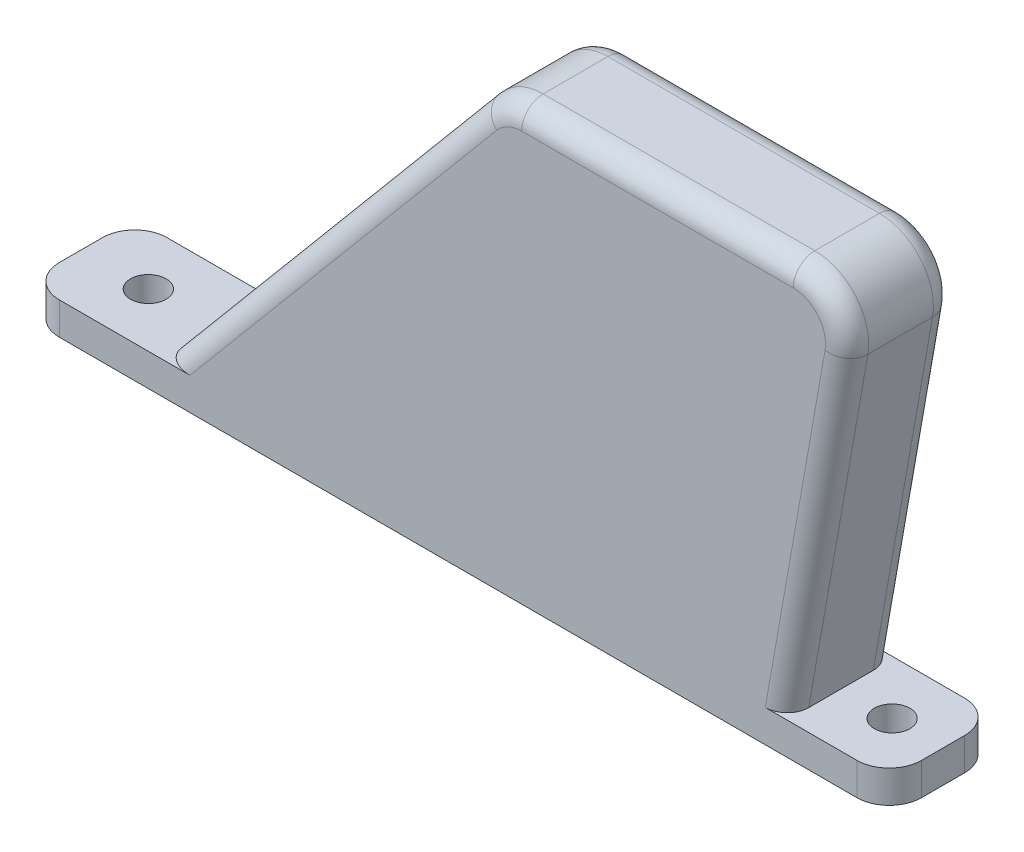
ISO-10303-21;
HEADER;
FILE_DESCRIPTION(('STEP AP214'),'2;1');
FILE_NAME('part.step','',(''),(''),'','','');
FILE_SCHEMA(('AUTOMOTIVE_DESIGN { 1 0 10303 214 1 1 1 1 }'));
ENDSEC;
DATA;
#1=APPLICATION_CONTEXT('core data for automotive mechanical design processes');
#2=APPLICATION_PROTOCOL_DEFINITION('international standard','automotive_design',2000,#1);
#3=PRODUCT_CONTEXT('',#1,'mechanical');
#4=PRODUCT('Part','Part','',(#3));
#5=PRODUCT_RELATED_PRODUCT_CATEGORY('part','',(#4));
#6=PRODUCT_DEFINITION_FORMATION('','',#4);
#7=PRODUCT_DEFINITION_CONTEXT('part definition',#1,'design');
#8=PRODUCT_DEFINITION('design','',#6,#7);
#9=PRODUCT_DEFINITION_SHAPE('','',#8);
#10=(LENGTH_UNIT() NAMED_UNIT(*) SI_UNIT(.MILLI.,.METRE.));
#11=(NAMED_UNIT(*) PLANE_ANGLE_UNIT() SI_UNIT($,.RADIAN.));
#12=(NAMED_UNIT(*) SI_UNIT($,.STERADIAN.) SOLID_ANGLE_UNIT());
#13=UNCERTAINTY_MEASURE_WITH_UNIT(LENGTH_MEASURE(1.E-05),#10,'distance_accuracy_value','');
#14=(GEOMETRIC_REPRESENTATION_CONTEXT(3) GLOBAL_UNCERTAINTY_ASSIGNED_CONTEXT((#13)) GLOBAL_UNIT_ASSIGNED_CONTEXT((#10,
#11,#12)) REPRESENTATION_CONTEXT('',''));
#15=CARTESIAN_POINT('',(0.,0.,0.));
#16=DIRECTION('',(0.,0.,1.));
#17=DIRECTION('',(1.,0.,0.));
#18=AXIS2_PLACEMENT_3D('',#15,#16,#17);
#19=CARTESIAN_POINT('',(0.,0.,10.));
#20=DIRECTION('',(-0.766044443118979,0.642787609686538,0.));
#21=DIRECTION('',(-0.642787609686538,-0.766044443118979,0.));
#22=AXIS2_PLACEMENT_3D('',#19,#20,#21);
#23=PLANE('',#22);
#24=DIRECTION('',(0.,0.,-1.));
#25=VECTOR('',#24,1.);
#26=CARTESIAN_POINT('',(32.0653013222712,38.2139380484327,10.));
#27=LINE('',#26,#25);
#28=CARTESIAN_POINT('',(32.0653013222712,38.2139380484327,8.));
#29=VERTEX_POINT('',#28);
#30=CARTESIAN_POINT('',(32.0653013222712,38.2139380484327,2.));
#31=VERTEX_POINT('',#30);
#32=EDGE_CURVE('E250',#29,#31,#27,.T.);
#33=ORIENTED_EDGE('',*,*,#32,.T.);
#34=DIRECTION('',(0.642787609686538,0.766044443118979,0.));
#35=VECTOR('',#34,1.);
#36=CARTESIAN_POINT('',(2.51729889353183,3.,2.));
#37=LINE('',#36,#35);
#38=CARTESIAN_POINT('',(2.51729889353183,3.,2.));
#39=VERTEX_POINT('',#38);
#40=EDGE_CURVE('E67',#31,#39,#37,.F.);
#41=ORIENTED_EDGE('',*,*,#40,.T.);
#42=DIRECTION('',(0.,0.,1.));
#43=VECTOR('',#42,1.);
#44=CARTESIAN_POINT('',(2.51729889353183,3.,10.));
#45=LINE('',#44,#43);
#46=CARTESIAN_POINT('',(2.51729889353183,3.,8.));
#47=VERTEX_POINT('',#46);
#48=EDGE_CURVE('E365',#39,#47,#45,.T.);
#49=ORIENTED_EDGE('',*,*,#48,.T.);
#50=DIRECTION('',(0.642787609686538,0.766044443118979,0.));
#51=VECTOR('',#50,1.);
#52=CARTESIAN_POINT('',(0.,0.,8.));
#53=LINE('',#52,#51);
#54=EDGE_CURVE('E292',#47,#29,#53,.T.);
#55=ORIENTED_EDGE('',*,*,#54,.T.);
#56=EDGE_LOOP('',(#33,#41,#49,#55));
#57=FACE_BOUND('',#56,.T.);
#58=ADVANCED_FACE('F45',(#57),#23,.T.);
#59=CARTESIAN_POINT('',(58.1907786235773,-10.2606042997699,10.));
#60=DIRECTION('',(-0.984807753012209,0.173648177666927,0.));
#61=DIRECTION('',(-0.173648177666927,-0.984807753012209,0.));
#62=AXIS2_PLACEMENT_3D('',#59,#60,#61);
#63=PLANE('',#62);
#64=DIRECTION('',(0.,0.,1.));
#65=VECTOR('',#64,1.);
#66=CARTESIAN_POINT('',(60.5289809421254,3.,10.));
#67=LINE('',#66,#65);
#68=CARTESIAN_POINT('',(60.5289809421254,3.,2.));
#69=VERTEX_POINT('',#68);
#70=CARTESIAN_POINT('',(60.5289809421254,3.,8.));
#71=VERTEX_POINT('',#70);
#72=EDGE_CURVE('E363',#69,#71,#67,.T.);
#73=ORIENTED_EDGE('',*,*,#72,.F.);
#74=DIRECTION('',(0.173648177666927,0.984807753012209,0.));
#75=VECTOR('',#74,1.);
#76=CARTESIAN_POINT('',(58.1907786235773,-10.2606042997699,2.));
#77=LINE('',#76,#75);
#78=CARTESIAN_POINT('',(66.0183500304285,34.1317591116654,2.));
#79=VERTEX_POINT('',#78);
#80=EDGE_CURVE('E254',#69,#79,#77,.T.);
#81=ORIENTED_EDGE('',*,*,#80,.T.);
#82=DIRECTION('',(0.,0.,-1.));
#83=VECTOR('',#82,1.);
#84=CARTESIAN_POINT('',(66.0183500304285,34.1317591116654,10.));
#85=LINE('',#84,#83);
#86=CARTESIAN_POINT('',(66.0183500304285,34.1317591116654,8.));
#87=VERTEX_POINT('',#86);
#88=EDGE_CURVE('E247',#79,#87,#85,.F.);
#89=ORIENTED_EDGE('',*,*,#88,.T.);
#90=DIRECTION('',(0.173648177666927,0.984807753012209,0.));
#91=VECTOR('',#90,1.);
#92=CARTESIAN_POINT('',(60.5289809421254,3.,8.));
#93=LINE('',#92,#91);
#94=EDGE_CURVE('E252',#87,#71,#93,.F.);
#95=ORIENTED_EDGE('',*,*,#94,.T.);
#96=EDGE_LOOP('',(#73,#81,#89,#95));
#97=FACE_BOUND('',#96,.T.);
#98=ADVANCED_FACE('F351',(#97),#63,.F.);
#99=CARTESIAN_POINT('',(0.,40.,10.));
#100=DIRECTION('',(0.,1.,0.));
#101=DIRECTION('',(-1.,0.,0.));
#102=AXIS2_PLACEMENT_3D('',#99,#100,#101);
#103=PLANE('',#102);
#104=DIRECTION('',(0.,0.,-1.));
#105=VECTOR('',#104,1.);
#106=CARTESIAN_POINT('',(61.0943112653674,40.,0.));
#107=LINE('',#106,#105);
#108=CARTESIAN_POINT('',(61.0943112653674,40.,8.));
#109=VERTEX_POINT('',#108);
#110=CARTESIAN_POINT('',(61.0943112653674,40.,2.));
#111=VERTEX_POINT('',#110);
#112=EDGE_CURVE('E244',#109,#111,#107,.T.);
#113=ORIENTED_EDGE('',*,*,#112,.T.);
#114=DIRECTION('',(1.,0.,0.));
#115=VECTOR('',#114,1.);
#116=CARTESIAN_POINT('',(35.8955235378661,40.,2.));
#117=LINE('',#116,#115);
#118=CARTESIAN_POINT('',(35.8955235378661,40.,2.));
#119=VERTEX_POINT('',#118);
#120=EDGE_CURVE('E274',#111,#119,#117,.F.);
#121=ORIENTED_EDGE('',*,*,#120,.T.);
#122=DIRECTION('',(0.,0.,-1.));
#123=VECTOR('',#122,1.);
#124=CARTESIAN_POINT('',(35.8955235378661,40.,10.));
#125=LINE('',#124,#123);
#126=CARTESIAN_POINT('',(35.8955235378661,40.,8.));
#127=VERTEX_POINT('',#126);
#128=EDGE_CURVE('E241',#119,#127,#125,.F.);
#129=ORIENTED_EDGE('',*,*,#128,.T.);
#130=DIRECTION('',(1.,0.,0.));
#131=VECTOR('',#130,1.);
#132=CARTESIAN_POINT('',(0.,40.,8.));
#133=LINE('',#132,#131);
#134=EDGE_CURVE('E272',#127,#109,#133,.T.);
#135=ORIENTED_EDGE('',*,*,#134,.T.);
#136=EDGE_LOOP('',(#113,#121,#129,#135));
#137=FACE_BOUND('',#136,.T.);
#138=ADVANCED_FACE('F422',(#137),#103,.T.);
#139=CARTESIAN_POINT('',(0.,0.,10.));
#140=DIRECTION('',(0.,1.,0.));
#141=DIRECTION('',(0.,0.,1.));
#142=AXIS2_PLACEMENT_3D('',#139,#140,#141);
#143=PLANE('',#142);
#144=CARTESIAN_POINT('',(65.2644904710627,0.,5.));
#145=DIRECTION('',(0.,1.,0.));
#146=DIRECTION('',(0.,0.,1.));
#147=AXIS2_PLACEMENT_3D('',#144,#145,#146);
#148=CIRCLE('',#147,1.65);
#149=CARTESIAN_POINT('',(65.2644904710627,0.,6.65));
#150=VERTEX_POINT('',#149);
#151=EDGE_CURVE('E204',#150,#150,#148,.T.);
#152=ORIENTED_EDGE('',*,*,#151,.T.);
#153=EDGE_LOOP('',(#152));
#154=FACE_BOUND('',#153,.T.);
#155=CARTESIAN_POINT('',(-3.74135055323408,0.,5.));
#156=DIRECTION('',(0.,1.,0.));
#157=DIRECTION('',(0.,0.,1.));
#158=AXIS2_PLACEMENT_3D('',#155,#156,#157);
#159=CIRCLE('',#158,1.65);
#160=CARTESIAN_POINT('',(-3.74135055323408,0.,6.65));
#161=VERTEX_POINT('',#160);
#162=EDGE_CURVE('E313',#161,#161,#159,.T.);
#163=ORIENTED_EDGE('',*,*,#162,.T.);
#164=EDGE_LOOP('',(#163));
#165=FACE_BOUND('',#164,.T.);
#166=DIRECTION('',(0.,0.,-1.));
#167=VECTOR('',#166,1.);
#168=CARTESIAN_POINT('',(-10.,0.,10.));
#169=LINE('',#168,#167);
#170=CARTESIAN_POINT('',(-10.,0.,7.));
#171=VERTEX_POINT('',#170);
#172=CARTESIAN_POINT('',(-10.,0.,3.));
#173=VERTEX_POINT('',#172);
#174=EDGE_CURVE('E186',#171,#173,#169,.T.);
#175=ORIENTED_EDGE('',*,*,#174,.T.);
#176=CARTESIAN_POINT('',(-7.,0.,3.));
#177=DIRECTION('',(0.,1.,0.));
#178=DIRECTION('',(0.,0.,1.));
#179=AXIS2_PLACEMENT_3D('',#176,#177,#178);
#180=CIRCLE('',#179,3.);
#181=CARTESIAN_POINT('',(-7.,0.,0.));
#182=VERTEX_POINT('',#181);
#183=EDGE_CURVE('E218',#173,#182,#180,.F.);
#184=ORIENTED_EDGE('',*,*,#183,.T.);
#185=DIRECTION('',(1.,0.,0.));
#186=VECTOR('',#185,1.);
#187=CARTESIAN_POINT('',(0.,0.,0.));
#188=LINE('',#187,#186);
#189=CARTESIAN_POINT('',(67.,0.,0.));
#190=VERTEX_POINT('',#189);
#191=EDGE_CURVE('E211',#182,#190,#188,.T.);
#192=ORIENTED_EDGE('',*,*,#191,.T.);
#193=CARTESIAN_POINT('',(67.,0.,3.));
#194=DIRECTION('',(0.,1.,0.));
#195=DIRECTION('',(0.,0.,1.));
#196=AXIS2_PLACEMENT_3D('',#193,#194,#195);
#197=CIRCLE('',#196,3.);
#198=CARTESIAN_POINT('',(70.,0.,3.));
#199=VERTEX_POINT('',#198);
#200=EDGE_CURVE('E193',#190,#199,#197,.F.);
#201=ORIENTED_EDGE('',*,*,#200,.T.);
#202=DIRECTION('',(0.,0.,1.));
#203=VECTOR('',#202,1.);
#204=CARTESIAN_POINT('',(70.,0.,0.));
#205=LINE('',#204,#203);
#206=CARTESIAN_POINT('',(70.,0.,7.));
#207=VERTEX_POINT('',#206);
#208=EDGE_CURVE('E203',#199,#207,#205,.T.);
#209=ORIENTED_EDGE('',*,*,#208,.T.);
#210=CARTESIAN_POINT('',(67.,0.,7.));
#211=DIRECTION('',(0.,1.,0.));
#212=DIRECTION('',(0.,0.,1.));
#213=AXIS2_PLACEMENT_3D('',#210,#211,#212);
#214=CIRCLE('',#213,3.);
#215=CARTESIAN_POINT('',(67.,0.,10.));
#216=VERTEX_POINT('',#215);
#217=EDGE_CURVE('E216',#207,#216,#214,.F.);
#218=ORIENTED_EDGE('',*,*,#217,.T.);
#219=DIRECTION('',(1.,0.,0.));
#220=VECTOR('',#219,1.);
#221=CARTESIAN_POINT('',(0.,0.,10.));
#222=LINE('',#221,#220);
#223=CARTESIAN_POINT('',(-7.,0.,10.));
#224=VERTEX_POINT('',#223);
#225=EDGE_CURVE('E188',#224,#216,#222,.T.);
#226=ORIENTED_EDGE('',*,*,#225,.F.);
#227=CARTESIAN_POINT('',(-7.,0.,7.));
#228=DIRECTION('',(0.,1.,0.));
#229=DIRECTION('',(0.,0.,1.));
#230=AXIS2_PLACEMENT_3D('',#227,#228,#229);
#231=CIRCLE('',#230,3.);
#232=EDGE_CURVE('E183',#224,#171,#231,.F.);
#233=ORIENTED_EDGE('',*,*,#232,.T.);
#234=EDGE_LOOP('',(#175,#184,#192,#201,#209,#218,#226,#233));
#235=FACE_BOUND('',#234,.T.);
#236=ADVANCED_FACE('F185',(#154,#165,#235),#143,.F.);
#237=CARTESIAN_POINT('',(0.,0.,10.));
#238=DIRECTION('',(0.,0.,1.));
#239=DIRECTION('',(1.,0.,0.));
#240=AXIS2_PLACEMENT_3D('',#237,#238,#239);
#241=PLANE('',#240);
#242=DIRECTION('',(-1.,0.,0.));
#243=VECTOR('',#242,1.);
#244=CARTESIAN_POINT('',(60.,3.,10.));
#245=LINE('',#244,#243);
#246=CARTESIAN_POINT('',(67.,3.,10.));
#247=VERTEX_POINT('',#246);
#248=CARTESIAN_POINT('',(58.4981277183539,3.,10.));
#249=VERTEX_POINT('',#248);
#250=EDGE_CURVE('E361',#247,#249,#245,.T.);
#251=ORIENTED_EDGE('',*,*,#250,.T.);
#252=DIRECTION('',(0.173648177666927,0.984807753012209,0.));
#253=VECTOR('',#252,1.);
#254=CARTESIAN_POINT('',(64.0487345244041,34.4790554669992,10.));
#255=LINE('',#254,#253);
#256=CARTESIAN_POINT('',(64.0487345244041,34.4790554669992,10.));
#257=VERTEX_POINT('',#256);
#258=EDGE_CURVE('E289',#249,#257,#255,.T.);
#259=ORIENTED_EDGE('',*,*,#258,.T.);
#260=CARTESIAN_POINT('',(61.0943112653674,35.,10.));
#261=DIRECTION('',(0.,0.,1.));
#262=DIRECTION('',(1.,0.,0.));
#263=AXIS2_PLACEMENT_3D('',#260,#261,#262);
#264=CIRCLE('',#263,3.);
#265=CARTESIAN_POINT('',(61.0943112653674,38.,10.));
#266=VERTEX_POINT('',#265);
#267=EDGE_CURVE('E287',#257,#266,#264,.T.);
#268=ORIENTED_EDGE('',*,*,#267,.T.);
#269=DIRECTION('',(1.,0.,0.));
#270=VECTOR('',#269,1.);
#271=CARTESIAN_POINT('',(0.,38.,10.));
#272=LINE('',#271,#270);
#273=CARTESIAN_POINT('',(35.8955235378661,38.,10.));
#274=VERTEX_POINT('',#273);
#275=EDGE_CURVE('E285',#266,#274,#272,.F.);
#276=ORIENTED_EDGE('',*,*,#275,.T.);
#277=CARTESIAN_POINT('',(35.8955235378661,35.,10.));
#278=DIRECTION('',(0.,0.,1.));
#279=DIRECTION('',(1.,0.,0.));
#280=AXIS2_PLACEMENT_3D('',#277,#278,#279);
#281=CIRCLE('',#280,3.);
#282=CARTESIAN_POINT('',(33.5973902085091,36.9283628290596,10.));
#283=VERTEX_POINT('',#282);
#284=EDGE_CURVE('E283',#274,#283,#281,.T.);
#285=ORIENTED_EDGE('',*,*,#284,.T.);
#286=DIRECTION('',(0.642787609686538,0.766044443118979,0.));
#287=VECTOR('',#286,1.);
#288=CARTESIAN_POINT('',(1.53208888623796,-1.28557521937308,10.));
#289=LINE('',#288,#287);
#290=CARTESIAN_POINT('',(5.12811347219638,3.,10.));
#291=VERTEX_POINT('',#290);
#292=EDGE_CURVE('E280',#283,#291,#289,.F.);
#293=ORIENTED_EDGE('',*,*,#292,.T.);
#294=CARTESIAN_POINT('',(-6.99999999999999,3.,10.));
#295=VERTEX_POINT('',#294);
#296=EDGE_CURVE('E336',#291,#295,#245,.T.);
#297=ORIENTED_EDGE('',*,*,#296,.T.);
#298=DIRECTION('',(0.,-1.,0.));
#299=VECTOR('',#298,1.);
#300=CARTESIAN_POINT('',(-7.,0.,10.));
#301=LINE('',#300,#299);
#302=EDGE_CURVE('E233',#295,#224,#301,.T.);
#303=ORIENTED_EDGE('',*,*,#302,.T.);
#304=ORIENTED_EDGE('',*,*,#225,.T.);
#305=DIRECTION('',(0.,-1.,0.));
#306=VECTOR('',#305,1.);
#307=CARTESIAN_POINT('',(67.,0.,10.));
#308=LINE('',#307,#306);
#309=EDGE_CURVE('E235',#216,#247,#308,.F.);
#310=ORIENTED_EDGE('',*,*,#309,.T.);
#311=EDGE_LOOP('',(#251,#259,#268,#276,#285,#293,#297,#303,#304,#310));
#312=FACE_BOUND('',#311,.T.);
#313=ADVANCED_FACE('F335',(#312),#241,.T.);
#314=CARTESIAN_POINT('',(0.,0.,0.));
#315=DIRECTION('',(0.,0.,1.));
#316=DIRECTION('',(1.,0.,0.));
#317=AXIS2_PLACEMENT_3D('',#314,#315,#316);
#318=PLANE('',#317);
#319=DIRECTION('',(0.173648177666927,0.984807753012209,0.));
#320=VECTOR('',#319,1.);
#321=CARTESIAN_POINT('',(56.2211631175529,-9.91330794443604,0.));
#322=LINE('',#321,#320);
#323=CARTESIAN_POINT('',(64.0487345244041,34.4790554669992,0.));
#324=VERTEX_POINT('',#323);
#325=CARTESIAN_POINT('',(58.4981277183539,3.,0.));
#326=VERTEX_POINT('',#325);
#327=EDGE_CURVE('E265',#324,#326,#322,.F.);
#328=ORIENTED_EDGE('',*,*,#327,.T.);
#329=DIRECTION('',(1.,0.,0.));
#330=VECTOR('',#329,1.);
#331=CARTESIAN_POINT('',(-10.,3.,0.));
#332=LINE('',#331,#330);
#333=CARTESIAN_POINT('',(67.,3.,0.));
#334=VERTEX_POINT('',#333);
#335=EDGE_CURVE('E376',#326,#334,#332,.T.);
#336=ORIENTED_EDGE('',*,*,#335,.T.);
#337=DIRECTION('',(0.,-1.,0.));
#338=VECTOR('',#337,1.);
#339=CARTESIAN_POINT('',(67.,0.,0.));
#340=LINE('',#339,#338);
#341=EDGE_CURVE('E220',#334,#190,#340,.T.);
#342=ORIENTED_EDGE('',*,*,#341,.T.);
#343=ORIENTED_EDGE('',*,*,#191,.F.);
#344=DIRECTION('',(0.,-1.,0.));
#345=VECTOR('',#344,1.);
#346=CARTESIAN_POINT('',(-7.,3.,0.));
#347=LINE('',#346,#345);
#348=CARTESIAN_POINT('',(-7.,3.,0.));
#349=VERTEX_POINT('',#348);
#350=EDGE_CURVE('E223',#182,#349,#347,.F.);
#351=ORIENTED_EDGE('',*,*,#350,.T.);
#352=CARTESIAN_POINT('',(5.12811347219638,3.,0.));
#353=VERTEX_POINT('',#352);
#354=EDGE_CURVE('E370',#349,#353,#332,.T.);
#355=ORIENTED_EDGE('',*,*,#354,.T.);
#356=DIRECTION('',(0.642787609686538,0.766044443118979,0.));
#357=VECTOR('',#356,1.);
#358=CARTESIAN_POINT('',(33.5973902085091,36.9283628290596,0.));
#359=LINE('',#358,#357);
#360=CARTESIAN_POINT('',(33.5973902085091,36.9283628290596,0.));
#361=VERTEX_POINT('',#360);
#362=EDGE_CURVE('E257',#353,#361,#359,.T.);
#363=ORIENTED_EDGE('',*,*,#362,.T.);
#364=CARTESIAN_POINT('',(35.8955235378661,35.,0.));
#365=DIRECTION('',(0.,0.,1.));
#366=DIRECTION('',(1.,0.,0.));
#367=AXIS2_PLACEMENT_3D('',#364,#365,#366);
#368=CIRCLE('',#367,3.);
#369=CARTESIAN_POINT('',(35.8955235378661,38.,0.));
#370=VERTEX_POINT('',#369);
#371=EDGE_CURVE('E259',#361,#370,#368,.F.);
#372=ORIENTED_EDGE('',*,*,#371,.T.);
#373=DIRECTION('',(1.,0.,0.));
#374=VECTOR('',#373,1.);
#375=CARTESIAN_POINT('',(61.0943112653674,38.,0.));
#376=LINE('',#375,#374);
#377=CARTESIAN_POINT('',(61.0943112653674,38.,0.));
#378=VERTEX_POINT('',#377);
#379=EDGE_CURVE('E261',#370,#378,#376,.T.);
#380=ORIENTED_EDGE('',*,*,#379,.T.);
#381=CARTESIAN_POINT('',(61.0943112653674,35.,0.));
#382=DIRECTION('',(0.,0.,1.));
#383=DIRECTION('',(1.,0.,0.));
#384=AXIS2_PLACEMENT_3D('',#381,#382,#383);
#385=CIRCLE('',#384,3.);
#386=EDGE_CURVE('E263',#378,#324,#385,.F.);
#387=ORIENTED_EDGE('',*,*,#386,.T.);
#388=EDGE_LOOP('',(#328,#336,#342,#343,#351,#355,#363,#372,#380,#387));
#389=FACE_BOUND('',#388,.T.);
#390=ADVANCED_FACE('F411',(#389),#318,.F.);
#391=CARTESIAN_POINT('',(70.,3.,0.));
#392=DIRECTION('',(1.,0.,0.));
#393=DIRECTION('',(0.,0.,-1.));
#394=AXIS2_PLACEMENT_3D('',#391,#392,#393);
#395=PLANE('',#394);
#396=DIRECTION('',(0.,0.,1.));
#397=VECTOR('',#396,1.);
#398=CARTESIAN_POINT('',(70.,3.,0.));
#399=LINE('',#398,#397);
#400=CARTESIAN_POINT('',(70.,3.,3.));
#401=VERTEX_POINT('',#400);
#402=CARTESIAN_POINT('',(70.,3.,7.));
#403=VERTEX_POINT('',#402);
#404=EDGE_CURVE('E366',#401,#403,#399,.T.);
#405=ORIENTED_EDGE('',*,*,#404,.T.);
#406=DIRECTION('',(0.,-1.,0.));
#407=VECTOR('',#406,1.);
#408=CARTESIAN_POINT('',(70.,3.,7.));
#409=LINE('',#408,#407);
#410=EDGE_CURVE('E230',#403,#207,#409,.T.);
#411=ORIENTED_EDGE('',*,*,#410,.T.);
#412=ORIENTED_EDGE('',*,*,#208,.F.);
#413=DIRECTION('',(0.,-1.,0.));
#414=VECTOR('',#413,1.);
#415=CARTESIAN_POINT('',(70.,3.,3.));
#416=LINE('',#415,#414);
#417=EDGE_CURVE('E228',#199,#401,#416,.F.);
#418=ORIENTED_EDGE('',*,*,#417,.T.);
#419=EDGE_LOOP('',(#405,#411,#412,#418));
#420=FACE_BOUND('',#419,.T.);
#421=ADVANCED_FACE('F401',(#420),#395,.T.);
#422=CARTESIAN_POINT('',(0.,3.,0.));
#423=DIRECTION('',(0.,-1.,0.));
#424=DIRECTION('',(0.,0.,-1.));
#425=AXIS2_PLACEMENT_3D('',#422,#423,#424);
#426=PLANE('',#425);
#427=CARTESIAN_POINT('',(65.2644904710627,3.,5.));
#428=DIRECTION('',(0.,1.,0.));
#429=DIRECTION('',(0.,0.,1.));
#430=AXIS2_PLACEMENT_3D('',#427,#428,#429);
#431=CIRCLE('',#430,1.65);
#432=CARTESIAN_POINT('',(65.2644904710627,3.,6.65));
#433=VERTEX_POINT('',#432);
#434=EDGE_CURVE('E385',#433,#433,#431,.T.);
#435=ORIENTED_EDGE('',*,*,#434,.F.);
#436=EDGE_LOOP('',(#435));
#437=FACE_BOUND('',#436,.T.);
#438=ORIENTED_EDGE('',*,*,#250,.F.);
#439=CARTESIAN_POINT('',(67.,3.,7.));
#440=DIRECTION('',(0.,-1.,0.));
#441=DIRECTION('',(0.,0.,-1.));
#442=AXIS2_PLACEMENT_3D('',#439,#440,#441);
#443=CIRCLE('',#442,3.);
#444=EDGE_CURVE('E239',#247,#403,#443,.F.);
#445=ORIENTED_EDGE('',*,*,#444,.T.);
#446=ORIENTED_EDGE('',*,*,#404,.F.);
#447=CARTESIAN_POINT('',(67.,3.,3.));
#448=DIRECTION('',(0.,-1.,0.));
#449=DIRECTION('',(0.,0.,-1.));
#450=AXIS2_PLACEMENT_3D('',#447,#448,#449);
#451=CIRCLE('',#450,3.);
#452=EDGE_CURVE('E237',#401,#334,#451,.F.);
#453=ORIENTED_EDGE('',*,*,#452,.T.);
#454=ORIENTED_EDGE('',*,*,#335,.F.);
#455=CARTESIAN_POINT('',(58.4981277183539,3.,2.));
#456=DIRECTION('',(0.,-1.,0.));
#457=DIRECTION('',(1.,0.,0.));
#458=AXIS2_PLACEMENT_3D('',#455,#456,#457);
#459=ELLIPSE('',#458,2.03085322377149,2.);
#460=EDGE_CURVE('E295',#326,#69,#459,.T.);
#461=ORIENTED_EDGE('',*,*,#460,.T.);
#462=ORIENTED_EDGE('',*,*,#72,.T.);
#463=CARTESIAN_POINT('',(58.4981277183539,3.,8.));
#464=DIRECTION('',(0.,-1.,0.));
#465=DIRECTION('',(-1.,0.,0.));
#466=AXIS2_PLACEMENT_3D('',#463,#464,#465);
#467=ELLIPSE('',#466,2.03085322377149,2.);
#468=EDGE_CURVE('E297',#71,#249,#467,.T.);
#469=ORIENTED_EDGE('',*,*,#468,.T.);
#470=EDGE_LOOP('',(#438,#445,#446,#453,#454,#461,#462,#469));
#471=FACE_BOUND('',#470,.T.);
#472=ADVANCED_FACE('F360',(#437,#471),#426,.F.);
#473=CARTESIAN_POINT('',(-10.,3.,10.));
#474=DIRECTION('',(-1.,0.,0.));
#475=DIRECTION('',(0.,0.,1.));
#476=AXIS2_PLACEMENT_3D('',#473,#474,#475);
#477=PLANE('',#476);
#478=DIRECTION('',(0.,0.,-1.));
#479=VECTOR('',#478,1.);
#480=CARTESIAN_POINT('',(-10.,3.,10.));
#481=LINE('',#480,#479);
#482=CARTESIAN_POINT('',(-10.,3.,7.));
#483=VERTEX_POINT('',#482);
#484=CARTESIAN_POINT('',(-10.,3.,3.));
#485=VERTEX_POINT('',#484);
#486=EDGE_CURVE('E377',#483,#485,#481,.T.);
#487=ORIENTED_EDGE('',*,*,#486,.T.);
#488=DIRECTION('',(0.,-1.,0.));
#489=VECTOR('',#488,1.);
#490=CARTESIAN_POINT('',(-10.,0.,3.));
#491=LINE('',#490,#489);
#492=EDGE_CURVE('E194',#485,#173,#491,.T.);
#493=ORIENTED_EDGE('',*,*,#492,.T.);
#494=ORIENTED_EDGE('',*,*,#174,.F.);
#495=DIRECTION('',(0.,-1.,0.));
#496=VECTOR('',#495,1.);
#497=CARTESIAN_POINT('',(-10.,3.,7.));
#498=LINE('',#497,#496);
#499=EDGE_CURVE('E200',#171,#483,#498,.F.);
#500=ORIENTED_EDGE('',*,*,#499,.T.);
#501=EDGE_LOOP('',(#487,#493,#494,#500));
#502=FACE_BOUND('',#501,.T.);
#503=ADVANCED_FACE('F199',(#502),#477,.T.);
#504=CARTESIAN_POINT('',(-3.74135055323408,3.,5.));
#505=DIRECTION('',(0.,1.,0.));
#506=DIRECTION('',(0.,0.,1.));
#507=AXIS2_PLACEMENT_3D('',#504,#505,#506);
#508=CIRCLE('',#507,1.65);
#509=CARTESIAN_POINT('',(-3.74135055323408,3.,6.65));
#510=VERTEX_POINT('',#509);
#511=EDGE_CURVE('E382',#510,#510,#508,.T.);
#512=ORIENTED_EDGE('',*,*,#511,.F.);
#513=EDGE_LOOP('',(#512));
#514=FACE_BOUND('',#513,.T.);
#515=ORIENTED_EDGE('',*,*,#354,.F.);
#516=CARTESIAN_POINT('',(-7.,3.,3.));
#517=DIRECTION('',(0.,-1.,0.));
#518=DIRECTION('',(0.,0.,-1.));
#519=AXIS2_PLACEMENT_3D('',#516,#517,#518);
#520=CIRCLE('',#519,3.);
#521=EDGE_CURVE('E226',#349,#485,#520,.F.);
#522=ORIENTED_EDGE('',*,*,#521,.T.);
#523=ORIENTED_EDGE('',*,*,#486,.F.);
#524=CARTESIAN_POINT('',(-7.,3.,7.));
#525=DIRECTION('',(0.,-1.,0.));
#526=DIRECTION('',(0.,0.,-1.));
#527=AXIS2_PLACEMENT_3D('',#524,#525,#526);
#528=CIRCLE('',#527,3.);
#529=EDGE_CURVE('E208',#483,#295,#528,.F.);
#530=ORIENTED_EDGE('',*,*,#529,.T.);
#531=ORIENTED_EDGE('',*,*,#296,.F.);
#532=CARTESIAN_POINT('',(5.12811347219638,3.,8.));
#533=DIRECTION('',(0.,-1.,0.));
#534=DIRECTION('',(1.,0.,0.));
#535=AXIS2_PLACEMENT_3D('',#532,#533,#534);
#536=ELLIPSE('',#535,2.61081457866455,2.);
#537=EDGE_CURVE('E11',#291,#47,#536,.T.);
#538=ORIENTED_EDGE('',*,*,#537,.T.);
#539=ORIENTED_EDGE('',*,*,#48,.F.);
#540=CARTESIAN_POINT('',(5.12811347219638,3.,2.));
#541=DIRECTION('',(0.,-1.,0.));
#542=DIRECTION('',(-1.,0.,0.));
#543=AXIS2_PLACEMENT_3D('',#540,#541,#542);
#544=ELLIPSE('',#543,2.61081457866455,2.);
#545=EDGE_CURVE('E54',#39,#353,#544,.T.);
#546=ORIENTED_EDGE('',*,*,#545,.T.);
#547=EDGE_LOOP('',(#515,#522,#523,#530,#531,#538,#539,#546));
#548=FACE_BOUND('',#547,.T.);
#549=ADVANCED_FACE('F403',(#514,#548),#426,.F.);
#550=CARTESIAN_POINT('',(-7.,3.,3.));
#551=DIRECTION('',(0.,1.,0.));
#552=DIRECTION('',(0.,0.,1.));
#553=AXIS2_PLACEMENT_3D('',#550,#551,#552);
#554=CYLINDRICAL_SURFACE('',#553,3.);
#555=ORIENTED_EDGE('',*,*,#521,.F.);
#556=ORIENTED_EDGE('',*,*,#350,.F.);
#557=ORIENTED_EDGE('',*,*,#183,.F.);
#558=ORIENTED_EDGE('',*,*,#492,.F.);
#559=EDGE_LOOP('',(#555,#556,#557,#558));
#560=FACE_BOUND('',#559,.T.);
#561=ADVANCED_FACE('F415',(#560),#554,.T.);
#562=CARTESIAN_POINT('',(67.,3.,7.));
#563=DIRECTION('',(0.,-1.,0.));
#564=DIRECTION('',(0.,0.,-1.));
#565=AXIS2_PLACEMENT_3D('',#562,#563,#564);
#566=CYLINDRICAL_SURFACE('',#565,3.);
#567=ORIENTED_EDGE('',*,*,#444,.F.);
#568=ORIENTED_EDGE('',*,*,#309,.F.);
#569=ORIENTED_EDGE('',*,*,#217,.F.);
#570=ORIENTED_EDGE('',*,*,#410,.F.);
#571=EDGE_LOOP('',(#567,#568,#569,#570));
#572=FACE_BOUND('',#571,.T.);
#573=ADVANCED_FACE('F431',(#572),#566,.T.);
#574=CARTESIAN_POINT('',(67.,0.,3.));
#575=DIRECTION('',(0.,1.,0.));
#576=DIRECTION('',(0.,0.,1.));
#577=AXIS2_PLACEMENT_3D('',#574,#575,#576);
#578=CYLINDRICAL_SURFACE('',#577,3.);
#579=ORIENTED_EDGE('',*,*,#452,.F.);
#580=ORIENTED_EDGE('',*,*,#417,.F.);
#581=ORIENTED_EDGE('',*,*,#200,.F.);
#582=ORIENTED_EDGE('',*,*,#341,.F.);
#583=EDGE_LOOP('',(#579,#580,#581,#582));
#584=FACE_BOUND('',#583,.T.);
#585=ADVANCED_FACE('F435',(#584),#578,.T.);
#586=CARTESIAN_POINT('',(-7.,0.,7.));
#587=DIRECTION('',(0.,-1.,0.));
#588=DIRECTION('',(0.,0.,-1.));
#589=AXIS2_PLACEMENT_3D('',#586,#587,#588);
#590=CYLINDRICAL_SURFACE('',#589,3.);
#591=ORIENTED_EDGE('',*,*,#529,.F.);
#592=ORIENTED_EDGE('',*,*,#499,.F.);
#593=ORIENTED_EDGE('',*,*,#232,.F.);
#594=ORIENTED_EDGE('',*,*,#302,.F.);
#595=EDGE_LOOP('',(#591,#592,#593,#594));
#596=FACE_BOUND('',#595,.T.);
#597=ADVANCED_FACE('F207',(#596),#590,.T.);
#598=CARTESIAN_POINT('',(-3.74135055323408,0.,5.));
#599=DIRECTION('',(0.,1.,0.));
#600=DIRECTION('',(0.,0.,1.));
#601=AXIS2_PLACEMENT_3D('',#598,#599,#600);
#602=CYLINDRICAL_SURFACE('',#601,1.65);
#603=ORIENTED_EDGE('',*,*,#162,.F.);
#604=EDGE_LOOP('',(#603));
#605=FACE_BOUND('',#604,.T.);
#606=ORIENTED_EDGE('',*,*,#511,.T.);
#607=EDGE_LOOP('',(#606));
#608=FACE_BOUND('',#607,.T.);
#609=ADVANCED_FACE('F396',(#605,#608),#602,.F.);
#610=CARTESIAN_POINT('',(65.2644904710627,0.,5.));
#611=DIRECTION('',(0.,1.,0.));
#612=DIRECTION('',(0.,0.,1.));
#613=AXIS2_PLACEMENT_3D('',#610,#611,#612);
#614=CYLINDRICAL_SURFACE('',#613,1.65);
#615=ORIENTED_EDGE('',*,*,#151,.F.);
#616=EDGE_LOOP('',(#615));
#617=FACE_BOUND('',#616,.T.);
#618=ORIENTED_EDGE('',*,*,#434,.T.);
#619=EDGE_LOOP('',(#618));
#620=FACE_BOUND('',#619,.T.);
#621=ADVANCED_FACE('F393',(#617,#620),#614,.F.);
#622=CARTESIAN_POINT('',(61.0943112653674,35.,10.));
#623=DIRECTION('',(0.,0.,1.));
#624=DIRECTION('',(1.,0.,0.));
#625=AXIS2_PLACEMENT_3D('',#622,#623,#624);
#626=CYLINDRICAL_SURFACE('',#625,5.);
#627=ORIENTED_EDGE('',*,*,#88,.F.);
#628=CARTESIAN_POINT('',(61.0943112653674,35.,2.));
#629=DIRECTION('',(0.,0.,1.));
#630=DIRECTION('',(1.,0.,0.));
#631=AXIS2_PLACEMENT_3D('',#628,#629,#630);
#632=CIRCLE('',#631,5.);
#633=EDGE_CURVE('E270',#79,#111,#632,.T.);
#634=ORIENTED_EDGE('',*,*,#633,.T.);
#635=ORIENTED_EDGE('',*,*,#112,.F.);
#636=CARTESIAN_POINT('',(61.0943112653674,35.,8.));
#637=DIRECTION('',(0.,0.,1.));
#638=DIRECTION('',(1.,0.,0.));
#639=AXIS2_PLACEMENT_3D('',#636,#637,#638);
#640=CIRCLE('',#639,5.);
#641=EDGE_CURVE('E268',#109,#87,#640,.F.);
#642=ORIENTED_EDGE('',*,*,#641,.T.);
#643=EDGE_LOOP('',(#627,#634,#635,#642));
#644=FACE_BOUND('',#643,.T.);
#645=ADVANCED_FACE('F347',(#644),#626,.T.);
#646=CARTESIAN_POINT('',(35.8955235378661,35.,10.));
#647=DIRECTION('',(0.,0.,-1.));
#648=DIRECTION('',(-1.,0.,0.));
#649=AXIS2_PLACEMENT_3D('',#646,#647,#648);
#650=CYLINDRICAL_SURFACE('',#649,5.);
#651=ORIENTED_EDGE('',*,*,#128,.F.);
#652=CARTESIAN_POINT('',(35.8955235378661,35.,2.));
#653=DIRECTION('',(0.,0.,1.));
#654=DIRECTION('',(1.,0.,0.));
#655=AXIS2_PLACEMENT_3D('',#652,#653,#654);
#656=CIRCLE('',#655,5.);
#657=EDGE_CURVE('E278',#119,#31,#656,.T.);
#658=ORIENTED_EDGE('',*,*,#657,.T.);
#659=ORIENTED_EDGE('',*,*,#32,.F.);
#660=CARTESIAN_POINT('',(35.8955235378661,35.,8.));
#661=DIRECTION('',(0.,0.,1.));
#662=DIRECTION('',(1.,0.,0.));
#663=AXIS2_PLACEMENT_3D('',#660,#661,#662);
#664=CIRCLE('',#663,5.);
#665=EDGE_CURVE('E276',#29,#127,#664,.F.);
#666=ORIENTED_EDGE('',*,*,#665,.T.);
#667=EDGE_LOOP('',(#651,#658,#659,#666));
#668=FACE_BOUND('',#667,.T.);
#669=ADVANCED_FACE('F444',(#668),#650,.T.);
#670=CARTESIAN_POINT('',(1.53208888623796,-1.28557521937308,2.));
#671=DIRECTION('',(-0.642787609686538,-0.766044443118979,0.));
#672=DIRECTION('',(0.766044443118979,-0.642787609686538,0.));
#673=AXIS2_PLACEMENT_3D('',#670,#671,#672);
#674=CYLINDRICAL_SURFACE('',#673,2.);
#675=ORIENTED_EDGE('',*,*,#545,.F.);
#676=ORIENTED_EDGE('',*,*,#40,.F.);
#677=CARTESIAN_POINT('',(33.5973902085091,36.9283628290596,2.));
#678=DIRECTION('',(0.642787609686537,0.76604444311898,0.));
#679=DIRECTION('',(-0.76604444311898,0.642787609686537,0.));
#680=AXIS2_PLACEMENT_3D('',#677,#678,#679);
#681=CIRCLE('',#680,2.);
#682=EDGE_CURVE('E310',#361,#31,#681,.T.);
#683=ORIENTED_EDGE('',*,*,#682,.F.);
#684=ORIENTED_EDGE('',*,*,#362,.F.);
#685=EDGE_LOOP('',(#675,#676,#683,#684));
#686=FACE_BOUND('',#685,.T.);
#687=ADVANCED_FACE('F447',(#686),#674,.T.);
#688=CARTESIAN_POINT('',(35.8955235378661,35.,2.));
#689=DIRECTION('',(0.,0.,1.));
#690=DIRECTION('',(1.,0.,0.));
#691=AXIS2_PLACEMENT_3D('',#688,#689,#690);
#692=TOROIDAL_SURFACE('',#691,3.,2.);
#693=ORIENTED_EDGE('',*,*,#682,.T.);
#694=ORIENTED_EDGE('',*,*,#657,.F.);
#695=CARTESIAN_POINT('',(35.8955235378661,38.,2.));
#696=DIRECTION('',(1.,0.,0.));
#697=DIRECTION('',(0.,0.,-1.));
#698=AXIS2_PLACEMENT_3D('',#695,#696,#697);
#699=CIRCLE('',#698,2.);
#700=EDGE_CURVE('E307',#370,#119,#699,.T.);
#701=ORIENTED_EDGE('',*,*,#700,.F.);
#702=ORIENTED_EDGE('',*,*,#371,.F.);
#703=EDGE_LOOP('',(#693,#694,#701,#702));
#704=FACE_BOUND('',#703,.T.);
#705=ADVANCED_FACE('F460',(#704),#692,.T.);
#706=CARTESIAN_POINT('',(0.,38.,2.));
#707=DIRECTION('',(-1.,0.,0.));
#708=DIRECTION('',(0.,-1.,0.));
#709=AXIS2_PLACEMENT_3D('',#706,#707,#708);
#710=CYLINDRICAL_SURFACE('',#709,2.);
#711=ORIENTED_EDGE('',*,*,#700,.T.);
#712=ORIENTED_EDGE('',*,*,#120,.F.);
#713=CARTESIAN_POINT('',(61.0943112653674,38.,2.));
#714=DIRECTION('',(1.,0.,0.));
#715=DIRECTION('',(0.,0.,-1.));
#716=AXIS2_PLACEMENT_3D('',#713,#714,#715);
#717=CIRCLE('',#716,2.);
#718=EDGE_CURVE('E304',#378,#111,#717,.T.);
#719=ORIENTED_EDGE('',*,*,#718,.F.);
#720=ORIENTED_EDGE('',*,*,#379,.F.);
#721=EDGE_LOOP('',(#711,#712,#719,#720));
#722=FACE_BOUND('',#721,.T.);
#723=ADVANCED_FACE('F456',(#722),#710,.T.);
#724=CARTESIAN_POINT('',(61.0943112653674,35.,2.));
#725=DIRECTION('',(0.,0.,1.));
#726=DIRECTION('',(1.,0.,0.));
#727=AXIS2_PLACEMENT_3D('',#724,#725,#726);
#728=TOROIDAL_SURFACE('',#727,3.,2.);
#729=ORIENTED_EDGE('',*,*,#718,.T.);
#730=ORIENTED_EDGE('',*,*,#633,.F.);
#731=CARTESIAN_POINT('',(64.0487345244041,34.4790554669992,2.));
#732=DIRECTION('',(-0.173648177666929,-0.984807753012208,0.));
#733=DIRECTION('',(0.984807753012208,-0.173648177666929,0.));
#734=AXIS2_PLACEMENT_3D('',#731,#732,#733);
#735=CIRCLE('',#734,2.);
#736=EDGE_CURVE('E302',#324,#79,#735,.T.);
#737=ORIENTED_EDGE('',*,*,#736,.F.);
#738=ORIENTED_EDGE('',*,*,#386,.F.);
#739=EDGE_LOOP('',(#729,#730,#737,#738));
#740=FACE_BOUND('',#739,.T.);
#741=ADVANCED_FACE('F452',(#740),#728,.T.);
#742=CARTESIAN_POINT('',(56.2211631175529,-9.91330794443604,2.));
#743=DIRECTION('',(0.173648177666927,0.984807753012209,0.));
#744=DIRECTION('',(-0.984807753012209,0.173648177666927,0.));
#745=AXIS2_PLACEMENT_3D('',#742,#743,#744);
#746=CYLINDRICAL_SURFACE('',#745,2.);
#747=ORIENTED_EDGE('',*,*,#460,.F.);
#748=ORIENTED_EDGE('',*,*,#327,.F.);
#749=ORIENTED_EDGE('',*,*,#736,.T.);
#750=ORIENTED_EDGE('',*,*,#80,.F.);
#751=EDGE_LOOP('',(#747,#748,#749,#750));
#752=FACE_BOUND('',#751,.T.);
#753=ADVANCED_FACE('F449',(#752),#746,.T.);
#754=CARTESIAN_POINT('',(1.53208888623796,-1.28557521937308,8.));
#755=DIRECTION('',(0.642787609686538,0.766044443118979,0.));
#756=DIRECTION('',(-0.766044443118979,0.642787609686538,0.));
#757=AXIS2_PLACEMENT_3D('',#754,#755,#756);
#758=CYLINDRICAL_SURFACE('',#757,2.);
#759=ORIENTED_EDGE('',*,*,#537,.F.);
#760=ORIENTED_EDGE('',*,*,#292,.F.);
#761=CARTESIAN_POINT('',(33.5973902085091,36.9283628290596,8.));
#762=DIRECTION('',(0.642787609686539,0.766044443118978,0.));
#763=DIRECTION('',(-0.766044443118978,0.642787609686539,0.));
#764=AXIS2_PLACEMENT_3D('',#761,#762,#763);
#765=CIRCLE('',#764,2.);
#766=EDGE_CURVE('E49',#29,#283,#765,.T.);
#767=ORIENTED_EDGE('',*,*,#766,.F.);
#768=ORIENTED_EDGE('',*,*,#54,.F.);
#769=EDGE_LOOP('',(#759,#760,#767,#768));
#770=FACE_BOUND('',#769,.T.);
#771=ADVANCED_FACE('F47',(#770),#758,.T.);
#772=CARTESIAN_POINT('',(35.8955235378661,35.,8.));
#773=DIRECTION('',(0.,0.,1.));
#774=DIRECTION('',(1.,0.,0.));
#775=AXIS2_PLACEMENT_3D('',#772,#773,#774);
#776=TOROIDAL_SURFACE('',#775,3.,2.);
#777=ORIENTED_EDGE('',*,*,#766,.T.);
#778=ORIENTED_EDGE('',*,*,#284,.F.);
#779=CARTESIAN_POINT('',(35.8955235378661,38.,8.));
#780=DIRECTION('',(1.,0.,0.));
#781=DIRECTION('',(0.,0.,-1.));
#782=AXIS2_PLACEMENT_3D('',#779,#780,#781);
#783=CIRCLE('',#782,2.);
#784=EDGE_CURVE('E318',#127,#274,#783,.T.);
#785=ORIENTED_EDGE('',*,*,#784,.F.);
#786=ORIENTED_EDGE('',*,*,#665,.F.);
#787=EDGE_LOOP('',(#777,#778,#785,#786));
#788=FACE_BOUND('',#787,.T.);
#789=ADVANCED_FACE('F329',(#788),#776,.T.);
#790=CARTESIAN_POINT('',(0.,38.,8.));
#791=DIRECTION('',(1.,0.,0.));
#792=DIRECTION('',(0.,1.,0.));
#793=AXIS2_PLACEMENT_3D('',#790,#791,#792);
#794=CYLINDRICAL_SURFACE('',#793,2.);
#795=ORIENTED_EDGE('',*,*,#784,.T.);
#796=ORIENTED_EDGE('',*,*,#275,.F.);
#797=CARTESIAN_POINT('',(61.0943112653674,38.,8.));
#798=DIRECTION('',(1.,0.,0.));
#799=DIRECTION('',(0.,0.,-1.));
#800=AXIS2_PLACEMENT_3D('',#797,#798,#799);
#801=CIRCLE('',#800,2.);
#802=EDGE_CURVE('E316',#109,#266,#801,.T.);
#803=ORIENTED_EDGE('',*,*,#802,.F.);
#804=ORIENTED_EDGE('',*,*,#134,.F.);
#805=EDGE_LOOP('',(#795,#796,#803,#804));
#806=FACE_BOUND('',#805,.T.);
#807=ADVANCED_FACE('F339',(#806),#794,.T.);
#808=CARTESIAN_POINT('',(61.0943112653674,35.,8.));
#809=DIRECTION('',(0.,0.,1.));
#810=DIRECTION('',(1.,0.,0.));
#811=AXIS2_PLACEMENT_3D('',#808,#809,#810);
#812=TOROIDAL_SURFACE('',#811,3.,2.);
#813=ORIENTED_EDGE('',*,*,#802,.T.);
#814=ORIENTED_EDGE('',*,*,#267,.F.);
#815=CARTESIAN_POINT('',(64.0487345244041,34.4790554669992,8.));
#816=DIRECTION('',(-0.173648177666929,-0.984807753012208,0.));
#817=DIRECTION('',(0.984807753012208,-0.173648177666929,0.));
#818=AXIS2_PLACEMENT_3D('',#815,#816,#817);
#819=CIRCLE('',#818,2.);
#820=EDGE_CURVE('E314',#87,#257,#819,.T.);
#821=ORIENTED_EDGE('',*,*,#820,.F.);
#822=ORIENTED_EDGE('',*,*,#641,.F.);
#823=EDGE_LOOP('',(#813,#814,#821,#822));
#824=FACE_BOUND('',#823,.T.);
#825=ADVANCED_FACE('F342',(#824),#812,.T.);
#826=CARTESIAN_POINT('',(56.2211631175529,-9.91330794443604,8.));
#827=DIRECTION('',(-0.173648177666927,-0.984807753012209,0.));
#828=DIRECTION('',(0.984807753012209,-0.173648177666927,0.));
#829=AXIS2_PLACEMENT_3D('',#826,#827,#828);
#830=CYLINDRICAL_SURFACE('',#829,2.);
#831=ORIENTED_EDGE('',*,*,#468,.F.);
#832=ORIENTED_EDGE('',*,*,#94,.F.);
#833=ORIENTED_EDGE('',*,*,#820,.T.);
#834=ORIENTED_EDGE('',*,*,#258,.F.);
#835=EDGE_LOOP('',(#831,#832,#833,#834));
#836=FACE_BOUND('',#835,.T.);
#837=ADVANCED_FACE('F356',(#836),#830,.T.);
#838=CLOSED_SHELL('',(#58,#98,#138,#236,#313,#390,#421,#472,#503,#549,#561,#573,#585,#597,#609,
#621,#645,#669,#687,#705,#723,#741,#753,#771,#789,#807,#825,#837));
#839=MANIFOLD_SOLID_BREP('B2',#838);
#840=ADVANCED_BREP_SHAPE_REPRESENTATION('',(#18,#839),#14);
#841=SHAPE_DEFINITION_REPRESENTATION(#9,#840);
ENDSEC;
END-ISO-10303-21;
